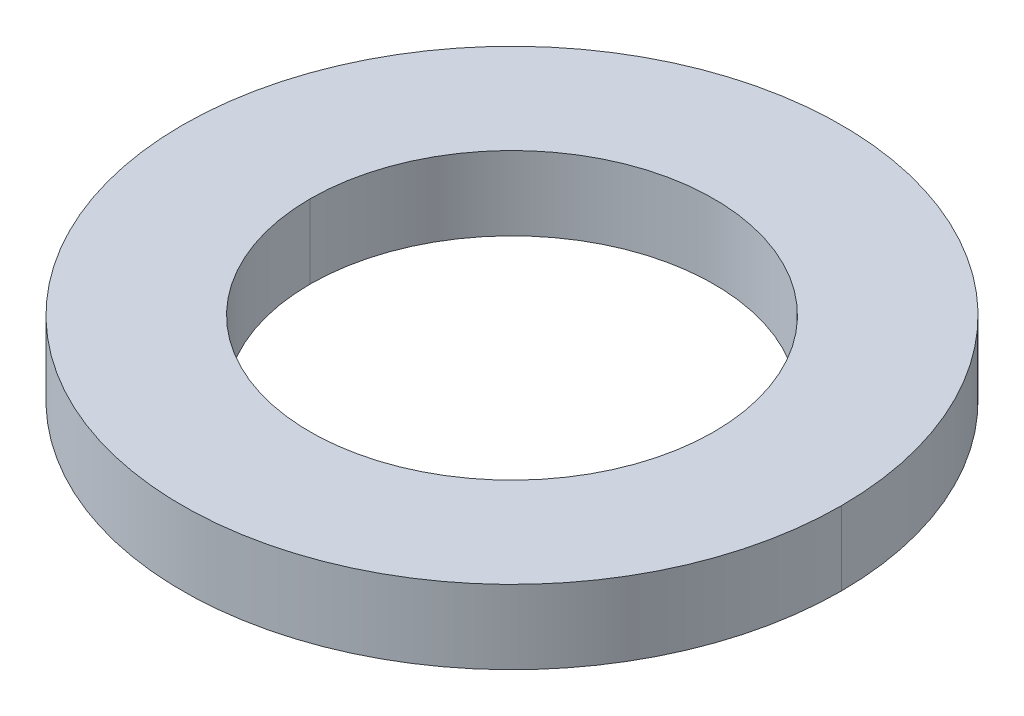
ISO-10303-21;
HEADER;
FILE_DESCRIPTION(('STEP AP214'),'2;1');
FILE_NAME('part.step','',(''),(''),'','','');
FILE_SCHEMA(('AUTOMOTIVE_DESIGN { 1 0 10303 214 1 1 1 1 }'));
ENDSEC;
DATA;
#1=APPLICATION_CONTEXT('core data for automotive mechanical design processes');
#2=APPLICATION_PROTOCOL_DEFINITION('international standard','automotive_design',2000,#1);
#3=PRODUCT_CONTEXT('',#1,'mechanical');
#4=PRODUCT('Part','Part','',(#3));
#5=PRODUCT_RELATED_PRODUCT_CATEGORY('part','',(#4));
#6=PRODUCT_DEFINITION_FORMATION('','',#4);
#7=PRODUCT_DEFINITION_CONTEXT('part definition',#1,'design');
#8=PRODUCT_DEFINITION('design','',#6,#7);
#9=PRODUCT_DEFINITION_SHAPE('','',#8);
#10=(LENGTH_UNIT() NAMED_UNIT(*) SI_UNIT(.MILLI.,.METRE.));
#11=(NAMED_UNIT(*) PLANE_ANGLE_UNIT() SI_UNIT($,.RADIAN.));
#12=(NAMED_UNIT(*) SI_UNIT($,.STERADIAN.) SOLID_ANGLE_UNIT());
#13=UNCERTAINTY_MEASURE_WITH_UNIT(LENGTH_MEASURE(1.E-05),#10,'distance_accuracy_value','');
#14=(GEOMETRIC_REPRESENTATION_CONTEXT(3) GLOBAL_UNCERTAINTY_ASSIGNED_CONTEXT((#13)) GLOBAL_UNIT_ASSIGNED_CONTEXT((#10,
#11,#12)) REPRESENTATION_CONTEXT('',''));
#15=CARTESIAN_POINT('',(0.,0.,0.));
#16=DIRECTION('',(0.,0.,1.));
#17=DIRECTION('',(1.,0.,0.));
#18=AXIS2_PLACEMENT_3D('',#15,#16,#17);
#19=CARTESIAN_POINT('',(0.,2.23231639555999,1.54533666301318));
#20=DIRECTION('',(0.,-1.,0.));
#21=DIRECTION('',(0.,0.,-1.));
#22=AXIS2_PLACEMENT_3D('',#19,#20,#21);
#23=PLANE('',#22);
#24=CARTESIAN_POINT('',(0.,2.23231639555999,0.));
#25=DIRECTION('',(0.,-1.,0.));
#26=DIRECTION('',(1.,0.,0.));
#27=AXIS2_PLACEMENT_3D('',#24,#25,#26);
#28=CIRCLE('',#27,1.54533666301318);
#29=CARTESIAN_POINT('',(1.54533666301318,2.23231639555999,0.));
#30=VERTEX_POINT('',#29);
#31=CARTESIAN_POINT('',(-1.54533666301318,2.23231639555999,0.));
#32=VERTEX_POINT('',#31);
#33=EDGE_CURVE('E60',#30,#32,#28,.T.);
#34=ORIENTED_EDGE('',*,*,#33,.T.);
#35=CARTESIAN_POINT('',(0.,2.23231639555999,0.));
#36=DIRECTION('',(0.,-1.,0.));
#37=DIRECTION('',(1.,0.,0.));
#38=AXIS2_PLACEMENT_3D('',#35,#36,#37);
#39=CIRCLE('',#38,1.54533666301318);
#40=EDGE_CURVE('E97',#32,#30,#39,.T.);
#41=ORIENTED_EDGE('',*,*,#40,.T.);
#42=EDGE_LOOP('',(#34,#41));
#43=FACE_BOUND('',#42,.T.);
#44=CARTESIAN_POINT('',(0.,2.23231639555999,0.));
#45=DIRECTION('',(0.,-1.,0.));
#46=DIRECTION('',(1.,0.,0.));
#47=AXIS2_PLACEMENT_3D('',#44,#45,#46);
#48=CIRCLE('',#47,2.52266833150659);
#49=CARTESIAN_POINT('',(2.52266833150659,2.23231639555999,0.));
#50=VERTEX_POINT('',#49);
#51=CARTESIAN_POINT('',(-2.52266833150659,2.23231639555999,0.));
#52=VERTEX_POINT('',#51);
#53=EDGE_CURVE('E94',#50,#52,#48,.T.);
#54=ORIENTED_EDGE('',*,*,#53,.F.);
#55=CARTESIAN_POINT('',(0.,2.23231639555999,0.));
#56=DIRECTION('',(0.,-1.,0.));
#57=DIRECTION('',(1.,0.,0.));
#58=AXIS2_PLACEMENT_3D('',#55,#56,#57);
#59=CIRCLE('',#58,2.52266833150659);
#60=EDGE_CURVE('E11',#52,#50,#59,.T.);
#61=ORIENTED_EDGE('',*,*,#60,.F.);
#62=EDGE_LOOP('',(#54,#61));
#63=FACE_BOUND('',#62,.T.);
#64=ADVANCED_FACE('F17',(#43,#63),#23,.F.);
#65=CARTESIAN_POINT('',(0.,-2.5,0.));
#66=DIRECTION('',(0.,-1.,0.));
#67=DIRECTION('',(1.,0.,0.));
#68=AXIS2_PLACEMENT_3D('',#65,#66,#67);
#69=CYLINDRICAL_SURFACE('',#68,2.52266833150659);
#70=DIRECTION('',(0.,-1.,0.));
#71=VECTOR('',#70,1.);
#72=CARTESIAN_POINT('',(-2.52266833150659,-2.5,0.));
#73=LINE('',#72,#71);
#74=CARTESIAN_POINT('',(-2.52266833150659,1.66666666666667,0.));
#75=VERTEX_POINT('',#74);
#76=EDGE_CURVE('E88',#52,#75,#73,.T.);
#77=ORIENTED_EDGE('',*,*,#76,.F.);
#78=ORIENTED_EDGE('',*,*,#60,.T.);
#79=DIRECTION('',(0.,-1.,0.));
#80=VECTOR('',#79,1.);
#81=CARTESIAN_POINT('',(2.52266833150659,-2.5,0.));
#82=LINE('',#81,#80);
#83=CARTESIAN_POINT('',(2.52266833150659,1.66666666666667,0.));
#84=VERTEX_POINT('',#83);
#85=EDGE_CURVE('E85',#50,#84,#82,.T.);
#86=ORIENTED_EDGE('',*,*,#85,.T.);
#87=CARTESIAN_POINT('',(0.,1.66666666666667,0.));
#88=DIRECTION('',(0.,-1.,0.));
#89=DIRECTION('',(1.,0.,0.));
#90=AXIS2_PLACEMENT_3D('',#87,#88,#89);
#91=CIRCLE('',#90,2.52266833150659);
#92=EDGE_CURVE('E26',#75,#84,#91,.T.);
#93=ORIENTED_EDGE('',*,*,#92,.F.);
#94=EDGE_LOOP('',(#77,#78,#86,#93));
#95=FACE_BOUND('',#94,.T.);
#96=ADVANCED_FACE('F19',(#95),#69,.T.);
#97=CARTESIAN_POINT('',(0.,1.66666666666667,1.54533666301318));
#98=DIRECTION('',(0.,1.,0.));
#99=DIRECTION('',(1.,0.,0.));
#100=AXIS2_PLACEMENT_3D('',#97,#98,#99);
#101=PLANE('',#100);
#102=CARTESIAN_POINT('',(0.,1.66666666666666,0.));
#103=DIRECTION('',(0.,-1.,0.));
#104=DIRECTION('',(1.,0.,0.));
#105=AXIS2_PLACEMENT_3D('',#102,#103,#104);
#106=CIRCLE('',#105,1.54533666301318);
#107=CARTESIAN_POINT('',(1.54533666301318,1.66666666666666,0.));
#108=VERTEX_POINT('',#107);
#109=CARTESIAN_POINT('',(-1.54533666301318,1.66666666666666,0.));
#110=VERTEX_POINT('',#109);
#111=EDGE_CURVE('E38',#108,#110,#106,.T.);
#112=ORIENTED_EDGE('',*,*,#111,.F.);
#113=CARTESIAN_POINT('',(0.,1.66666666666666,0.));
#114=DIRECTION('',(0.,-1.,0.));
#115=DIRECTION('',(1.,0.,0.));
#116=AXIS2_PLACEMENT_3D('',#113,#114,#115);
#117=CIRCLE('',#116,1.54533666301318);
#118=EDGE_CURVE('E119',#110,#108,#117,.T.);
#119=ORIENTED_EDGE('',*,*,#118,.F.);
#120=EDGE_LOOP('',(#112,#119));
#121=FACE_BOUND('',#120,.T.);
#122=CARTESIAN_POINT('',(0.,1.66666666666667,0.));
#123=DIRECTION('',(0.,-1.,0.));
#124=DIRECTION('',(1.,0.,0.));
#125=AXIS2_PLACEMENT_3D('',#122,#123,#124);
#126=CIRCLE('',#125,2.52266833150659);
#127=EDGE_CURVE('E95',#84,#75,#126,.T.);
#128=ORIENTED_EDGE('',*,*,#127,.T.);
#129=ORIENTED_EDGE('',*,*,#92,.T.);
#130=EDGE_LOOP('',(#128,#129));
#131=FACE_BOUND('',#130,.T.);
#132=ADVANCED_FACE('F162',(#121,#131),#101,.F.);
#133=CARTESIAN_POINT('',(0.,-2.5,0.));
#134=DIRECTION('',(0.,-1.,0.));
#135=DIRECTION('',(1.,0.,0.));
#136=AXIS2_PLACEMENT_3D('',#133,#134,#135);
#137=CYLINDRICAL_SURFACE('',#136,1.54533666301318);
#138=DIRECTION('',(0.,-1.,0.));
#139=VECTOR('',#138,1.);
#140=CARTESIAN_POINT('',(-1.54533666301318,-2.5,0.));
#141=LINE('',#140,#139);
#142=EDGE_CURVE('E112',#32,#110,#141,.T.);
#143=ORIENTED_EDGE('',*,*,#142,.F.);
#144=ORIENTED_EDGE('',*,*,#33,.F.);
#145=DIRECTION('',(0.,-1.,0.));
#146=VECTOR('',#145,1.);
#147=CARTESIAN_POINT('',(1.54533666301318,-2.5,0.));
#148=LINE('',#147,#146);
#149=EDGE_CURVE('E108',#30,#108,#148,.T.);
#150=ORIENTED_EDGE('',*,*,#149,.T.);
#151=ORIENTED_EDGE('',*,*,#111,.T.);
#152=EDGE_LOOP('',(#143,#144,#150,#151));
#153=FACE_BOUND('',#152,.T.);
#154=ADVANCED_FACE('F152',(#153),#137,.F.);
#155=CARTESIAN_POINT('',(0.,-2.5,0.));
#156=DIRECTION('',(0.,-1.,0.));
#157=DIRECTION('',(1.,0.,0.));
#158=AXIS2_PLACEMENT_3D('',#155,#156,#157);
#159=CYLINDRICAL_SURFACE('',#158,1.54533666301318);
#160=ORIENTED_EDGE('',*,*,#40,.F.);
#161=ORIENTED_EDGE('',*,*,#142,.T.);
#162=ORIENTED_EDGE('',*,*,#118,.T.);
#163=ORIENTED_EDGE('',*,*,#149,.F.);
#164=EDGE_LOOP('',(#160,#161,#162,#163));
#165=FACE_BOUND('',#164,.T.);
#166=ADVANCED_FACE('F142',(#165),#159,.F.);
#167=CARTESIAN_POINT('',(0.,-2.5,0.));
#168=DIRECTION('',(0.,-1.,0.));
#169=DIRECTION('',(1.,0.,0.));
#170=AXIS2_PLACEMENT_3D('',#167,#168,#169);
#171=CYLINDRICAL_SURFACE('',#170,2.52266833150659);
#172=ORIENTED_EDGE('',*,*,#53,.T.);
#173=ORIENTED_EDGE('',*,*,#76,.T.);
#174=ORIENTED_EDGE('',*,*,#127,.F.);
#175=ORIENTED_EDGE('',*,*,#85,.F.);
#176=EDGE_LOOP('',(#172,#173,#174,#175));
#177=FACE_BOUND('',#176,.T.);
#178=ADVANCED_FACE('F93',(#177),#171,.T.);
#179=CLOSED_SHELL('',(#64,#96,#132,#154,#166,#178));
#180=MANIFOLD_SOLID_BREP('B1',#179);
#181=ADVANCED_BREP_SHAPE_REPRESENTATION('',(#18,#180),#14);
#182=SHAPE_DEFINITION_REPRESENTATION(#9,#181);
ENDSEC;
END-ISO-10303-21;
